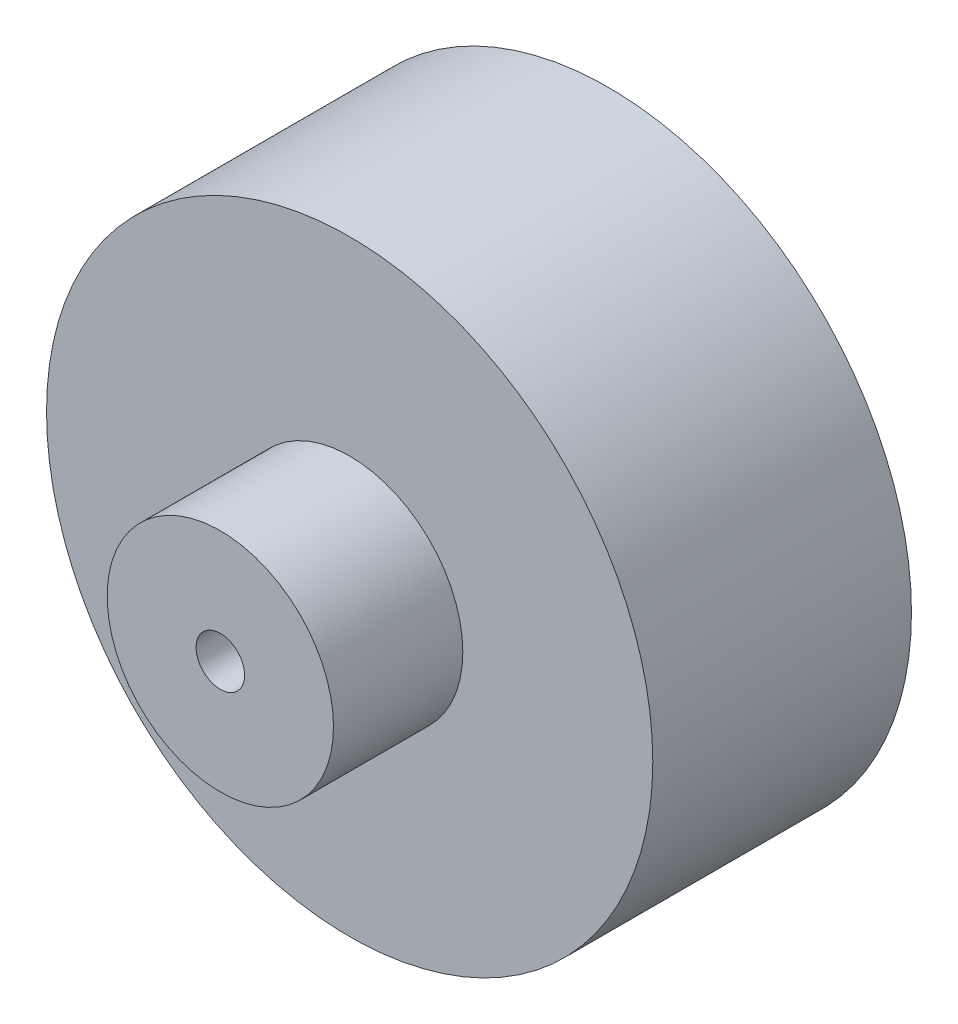
ISO-10303-21;
HEADER;
FILE_DESCRIPTION(('STEP AP214'),'2;1');
FILE_NAME('part.step','',(''),(''),'','','');
FILE_SCHEMA(('AUTOMOTIVE_DESIGN { 1 0 10303 214 1 1 1 1 }'));
ENDSEC;
DATA;
#1=APPLICATION_CONTEXT('core data for automotive mechanical design processes');
#2=APPLICATION_PROTOCOL_DEFINITION('international standard','automotive_design',2000,#1);
#3=PRODUCT_CONTEXT('',#1,'mechanical');
#4=PRODUCT('Part','Part','',(#3));
#5=PRODUCT_RELATED_PRODUCT_CATEGORY('part','',(#4));
#6=PRODUCT_DEFINITION_FORMATION('','',#4);
#7=PRODUCT_DEFINITION_CONTEXT('part definition',#1,'design');
#8=PRODUCT_DEFINITION('design','',#6,#7);
#9=PRODUCT_DEFINITION_SHAPE('','',#8);
#10=(LENGTH_UNIT() NAMED_UNIT(*) SI_UNIT(.MILLI.,.METRE.));
#11=(NAMED_UNIT(*) PLANE_ANGLE_UNIT() SI_UNIT($,.RADIAN.));
#12=(NAMED_UNIT(*) SI_UNIT($,.STERADIAN.) SOLID_ANGLE_UNIT());
#13=UNCERTAINTY_MEASURE_WITH_UNIT(LENGTH_MEASURE(1.E-05),#10,'distance_accuracy_value','');
#14=(GEOMETRIC_REPRESENTATION_CONTEXT(3) GLOBAL_UNCERTAINTY_ASSIGNED_CONTEXT((#13)) GLOBAL_UNIT_ASSIGNED_CONTEXT((#10,
#11,#12)) REPRESENTATION_CONTEXT('',''));
#15=CARTESIAN_POINT('',(0.,0.,0.));
#16=DIRECTION('',(0.,0.,1.));
#17=DIRECTION('',(1.,0.,0.));
#18=AXIS2_PLACEMENT_3D('',#15,#16,#17);
#19=CARTESIAN_POINT('',(0.,0.,32.));
#20=DIRECTION('',(0.,0.,-1.));
#21=DIRECTION('',(-1.,0.,0.));
#22=AXIS2_PLACEMENT_3D('',#19,#20,#21);
#23=CYLINDRICAL_SURFACE('',#22,37.5);
#24=CARTESIAN_POINT('',(0.,0.,32.));
#25=DIRECTION('',(0.,0.,1.));
#26=DIRECTION('',(1.,0.,0.));
#27=AXIS2_PLACEMENT_3D('',#24,#25,#26);
#28=CIRCLE('',#27,37.5);
#29=CARTESIAN_POINT('',(37.5,0.,32.));
#30=VERTEX_POINT('',#29);
#31=EDGE_CURVE('E40',#30,#30,#28,.T.);
#32=ORIENTED_EDGE('',*,*,#31,.F.);
#33=EDGE_LOOP('',(#32));
#34=FACE_BOUND('',#33,.T.);
#35=CARTESIAN_POINT('',(0.,0.,0.));
#36=DIRECTION('',(0.,0.,1.));
#37=DIRECTION('',(1.,0.,0.));
#38=AXIS2_PLACEMENT_3D('',#35,#36,#37);
#39=CIRCLE('',#38,37.5);
#40=CARTESIAN_POINT('',(37.5,0.,0.));
#41=VERTEX_POINT('',#40);
#42=EDGE_CURVE('E36',#41,#41,#39,.T.);
#43=ORIENTED_EDGE('',*,*,#42,.T.);
#44=EDGE_LOOP('',(#43));
#45=FACE_BOUND('',#44,.T.);
#46=ADVANCED_FACE('F33',(#34,#45),#23,.T.);
#47=CARTESIAN_POINT('',(0.,0.,32.));
#48=DIRECTION('',(0.,0.,1.));
#49=DIRECTION('',(1.,0.,0.));
#50=AXIS2_PLACEMENT_3D('',#47,#48,#49);
#51=PLANE('',#50);
#52=CARTESIAN_POINT('',(0.,0.,32.));
#53=DIRECTION('',(0.,0.,1.));
#54=DIRECTION('',(1.,0.,0.));
#55=AXIS2_PLACEMENT_3D('',#52,#53,#54);
#56=CIRCLE('',#55,14.);
#57=CARTESIAN_POINT('',(14.,0.,32.));
#58=VERTEX_POINT('',#57);
#59=EDGE_CURVE('E10',#58,#58,#56,.T.);
#60=ORIENTED_EDGE('',*,*,#59,.F.);
#61=EDGE_LOOP('',(#60));
#62=FACE_BOUND('',#61,.T.);
#63=ORIENTED_EDGE('',*,*,#31,.T.);
#64=EDGE_LOOP('',(#63));
#65=FACE_BOUND('',#64,.T.);
#66=ADVANCED_FACE('F71',(#62,#65),#51,.T.);
#67=CARTESIAN_POINT('',(0.,0.,0.));
#68=DIRECTION('',(0.,0.,1.));
#69=DIRECTION('',(1.,0.,0.));
#70=AXIS2_PLACEMENT_3D('',#67,#68,#69);
#71=PLANE('',#70);
#72=ORIENTED_EDGE('',*,*,#42,.F.);
#73=EDGE_LOOP('',(#72));
#74=FACE_BOUND('',#73,.T.);
#75=ADVANCED_FACE('F62',(#74),#71,.F.);
#76=CARTESIAN_POINT('',(0.,0.,48.));
#77=DIRECTION('',(0.,0.,1.));
#78=DIRECTION('',(1.,0.,0.));
#79=AXIS2_PLACEMENT_3D('',#76,#77,#78);
#80=PLANE('',#79);
#81=CARTESIAN_POINT('',(0.,0.,48.));
#82=DIRECTION('',(0.,0.,1.));
#83=DIRECTION('',(1.,0.,0.));
#84=AXIS2_PLACEMENT_3D('',#81,#82,#83);
#85=CIRCLE('',#84,14.);
#86=CARTESIAN_POINT('',(14.,0.,48.));
#87=VERTEX_POINT('',#86);
#88=EDGE_CURVE('E46',#87,#87,#85,.T.);
#89=ORIENTED_EDGE('',*,*,#88,.T.);
#90=EDGE_LOOP('',(#89));
#91=FACE_BOUND('',#90,.T.);
#92=CARTESIAN_POINT('',(0.,0.,48.));
#93=DIRECTION('',(0.,0.,1.));
#94=DIRECTION('',(1.,0.,0.));
#95=AXIS2_PLACEMENT_3D('',#92,#93,#94);
#96=CIRCLE('',#95,3.);
#97=CARTESIAN_POINT('',(3.,0.,48.));
#98=VERTEX_POINT('',#97);
#99=EDGE_CURVE('E49',#98,#98,#96,.T.);
#100=ORIENTED_EDGE('',*,*,#99,.F.);
#101=EDGE_LOOP('',(#100));
#102=FACE_BOUND('',#101,.T.);
#103=ADVANCED_FACE('F59',(#91,#102),#80,.T.);
#104=CARTESIAN_POINT('',(0.,0.,48.));
#105=DIRECTION('',(0.,0.,-1.));
#106=DIRECTION('',(-1.,0.,0.));
#107=AXIS2_PLACEMENT_3D('',#104,#105,#106);
#108=CYLINDRICAL_SURFACE('',#107,14.);
#109=ORIENTED_EDGE('',*,*,#88,.F.);
#110=EDGE_LOOP('',(#109));
#111=FACE_BOUND('',#110,.T.);
#112=ORIENTED_EDGE('',*,*,#59,.T.);
#113=EDGE_LOOP('',(#112));
#114=FACE_BOUND('',#113,.T.);
#115=ADVANCED_FACE('F61',(#111,#114),#108,.T.);
#116=CARTESIAN_POINT('',(0.,0.,48.));
#117=DIRECTION('',(0.,0.,-1.));
#118=DIRECTION('',(-1.,0.,0.));
#119=AXIS2_PLACEMENT_3D('',#116,#117,#118);
#120=CYLINDRICAL_SURFACE('',#119,3.);
#121=ORIENTED_EDGE('',*,*,#99,.T.);
#122=EDGE_LOOP('',(#121));
#123=FACE_BOUND('',#122,.T.);
#124=CARTESIAN_POINT('',(0.,0.,32.));
#125=DIRECTION('',(0.,0.,1.));
#126=DIRECTION('',(1.,0.,0.));
#127=AXIS2_PLACEMENT_3D('',#124,#125,#126);
#128=CIRCLE('',#127,3.);
#129=CARTESIAN_POINT('',(3.,0.,32.));
#130=VERTEX_POINT('',#129);
#131=EDGE_CURVE('E50',#130,#130,#128,.T.);
#132=ORIENTED_EDGE('',*,*,#131,.F.);
#133=EDGE_LOOP('',(#132));
#134=FACE_BOUND('',#133,.T.);
#135=ADVANCED_FACE('F56',(#123,#134),#120,.F.);
#136=ORIENTED_EDGE('',*,*,#131,.T.);
#137=EDGE_LOOP('',(#136));
#138=FACE_BOUND('',#137,.T.);
#139=ADVANCED_FACE('F81',(#138),#51,.T.);
#140=CLOSED_SHELL('',(#46,#66,#75,#103,#115,#135,#139));
#141=MANIFOLD_SOLID_BREP('B2',#140);
#142=ADVANCED_BREP_SHAPE_REPRESENTATION('',(#18,#141),#14);
#143=SHAPE_DEFINITION_REPRESENTATION(#9,#142);
ENDSEC;
END-ISO-10303-21;
